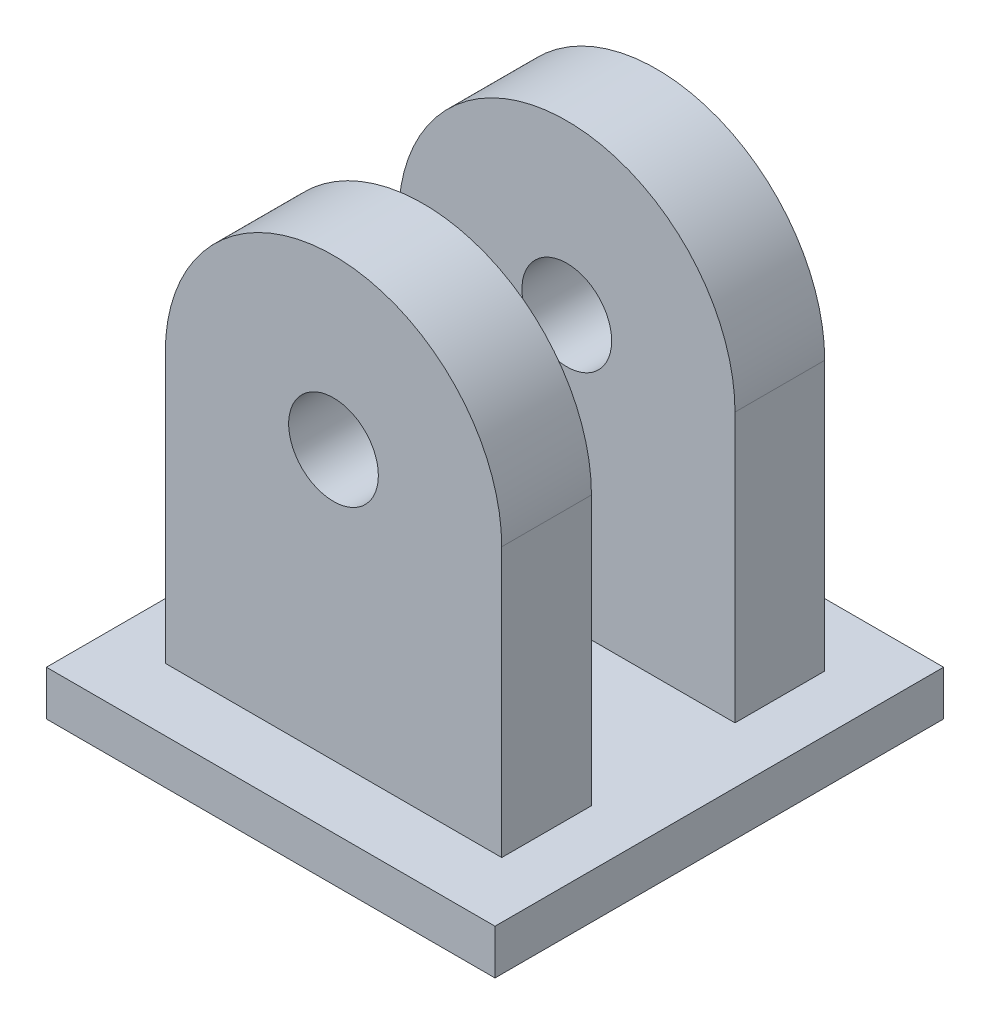
ISO-10303-21;
HEADER;
FILE_DESCRIPTION(('STEP AP214'),'2;1');
FILE_NAME('part.step','',(''),(''),'','','');
FILE_SCHEMA(('AUTOMOTIVE_DESIGN { 1 0 10303 214 1 1 1 1 }'));
ENDSEC;
DATA;
#1=APPLICATION_CONTEXT('core data for automotive mechanical design processes');
#2=APPLICATION_PROTOCOL_DEFINITION('international standard','automotive_design',2000,#1);
#3=PRODUCT_CONTEXT('',#1,'mechanical');
#4=PRODUCT('Part','Part','',(#3));
#5=PRODUCT_RELATED_PRODUCT_CATEGORY('part','',(#4));
#6=PRODUCT_DEFINITION_FORMATION('','',#4);
#7=PRODUCT_DEFINITION_CONTEXT('part definition',#1,'design');
#8=PRODUCT_DEFINITION('design','',#6,#7);
#9=PRODUCT_DEFINITION_SHAPE('','',#8);
#10=(LENGTH_UNIT() NAMED_UNIT(*) SI_UNIT(.MILLI.,.METRE.));
#11=(NAMED_UNIT(*) PLANE_ANGLE_UNIT() SI_UNIT($,.RADIAN.));
#12=(NAMED_UNIT(*) SI_UNIT($,.STERADIAN.) SOLID_ANGLE_UNIT());
#13=UNCERTAINTY_MEASURE_WITH_UNIT(LENGTH_MEASURE(1.E-05),#10,'distance_accuracy_value','');
#14=(GEOMETRIC_REPRESENTATION_CONTEXT(3) GLOBAL_UNCERTAINTY_ASSIGNED_CONTEXT((#13)) GLOBAL_UNIT_ASSIGNED_CONTEXT((#10,
#11,#12)) REPRESENTATION_CONTEXT('',''));
#15=CARTESIAN_POINT('',(0.,0.,0.));
#16=DIRECTION('',(0.,0.,1.));
#17=DIRECTION('',(1.,0.,0.));
#18=AXIS2_PLACEMENT_3D('',#15,#16,#17);
#19=CARTESIAN_POINT('',(0.,-6.,0.));
#20=DIRECTION('',(0.,1.,0.));
#21=DIRECTION('',(0.,0.,1.));
#22=AXIS2_PLACEMENT_3D('',#19,#20,#21);
#23=PLANE('',#22);
#24=DIRECTION('',(0.,0.,-1.));
#25=VECTOR('',#24,1.);
#26=CARTESIAN_POINT('',(-3.75,-6.,2.));
#27=LINE('',#26,#25);
#28=CARTESIAN_POINT('',(-3.75,-6.,2.));
#29=VERTEX_POINT('',#28);
#30=CARTESIAN_POINT('',(-3.75,-6.,0.));
#31=VERTEX_POINT('',#30);
#32=EDGE_CURVE('E41',#29,#31,#27,.T.);
#33=ORIENTED_EDGE('',*,*,#32,.T.);
#34=DIRECTION('',(1.,0.,0.));
#35=VECTOR('',#34,1.);
#36=CARTESIAN_POINT('',(3.75,-6.,0.));
#37=LINE('',#36,#35);
#38=CARTESIAN_POINT('',(3.75,-6.,0.));
#39=VERTEX_POINT('',#38);
#40=EDGE_CURVE('E207',#31,#39,#37,.T.);
#41=ORIENTED_EDGE('',*,*,#40,.T.);
#42=DIRECTION('',(0.,0.,-1.));
#43=VECTOR('',#42,1.);
#44=CARTESIAN_POINT('',(3.75,-6.,2.));
#45=LINE('',#44,#43);
#46=CARTESIAN_POINT('',(3.75,-6.,2.));
#47=VERTEX_POINT('',#46);
#48=EDGE_CURVE('E212',#47,#39,#45,.T.);
#49=ORIENTED_EDGE('',*,*,#48,.F.);
#50=DIRECTION('',(1.,0.,0.));
#51=VECTOR('',#50,1.);
#52=CARTESIAN_POINT('',(3.75,-6.,2.));
#53=LINE('',#52,#51);
#54=EDGE_CURVE('E198',#29,#47,#53,.T.);
#55=ORIENTED_EDGE('',*,*,#54,.F.);
#56=EDGE_LOOP('',(#33,#41,#49,#55));
#57=FACE_BOUND('',#56,.T.);
#58=DIRECTION('',(0.,0.,-1.));
#59=VECTOR('',#58,1.);
#60=CARTESIAN_POINT('',(-5.,-6.,8.6));
#61=LINE('',#60,#59);
#62=CARTESIAN_POINT('',(-5.,-6.,8.6));
#63=VERTEX_POINT('',#62);
#64=CARTESIAN_POINT('',(-5.,-6.,-1.4));
#65=VERTEX_POINT('',#64);
#66=EDGE_CURVE('E153',#63,#65,#61,.T.);
#67=ORIENTED_EDGE('',*,*,#66,.F.);
#68=DIRECTION('',(-1.,0.,0.));
#69=VECTOR('',#68,1.);
#70=CARTESIAN_POINT('',(5.,-6.,8.6));
#71=LINE('',#70,#69);
#72=CARTESIAN_POINT('',(5.,-6.,8.6));
#73=VERTEX_POINT('',#72);
#74=EDGE_CURVE('E166',#73,#63,#71,.T.);
#75=ORIENTED_EDGE('',*,*,#74,.F.);
#76=DIRECTION('',(0.,0.,1.));
#77=VECTOR('',#76,1.);
#78=CARTESIAN_POINT('',(5.,-6.,8.6));
#79=LINE('',#78,#77);
#80=CARTESIAN_POINT('',(5.,-6.,-1.4));
#81=VERTEX_POINT('',#80);
#82=EDGE_CURVE('E174',#81,#73,#79,.T.);
#83=ORIENTED_EDGE('',*,*,#82,.F.);
#84=DIRECTION('',(1.,0.,0.));
#85=VECTOR('',#84,1.);
#86=CARTESIAN_POINT('',(5.,-6.,-1.4));
#87=LINE('',#86,#85);
#88=EDGE_CURVE('E156',#65,#81,#87,.T.);
#89=ORIENTED_EDGE('',*,*,#88,.F.);
#90=EDGE_LOOP('',(#67,#75,#83,#89));
#91=FACE_BOUND('',#90,.T.);
#92=DIRECTION('',(1.,0.,0.));
#93=VECTOR('',#92,1.);
#94=CARTESIAN_POINT('',(3.75,-6.,7.2));
#95=LINE('',#94,#93);
#96=CARTESIAN_POINT('',(-3.75,-6.,7.2));
#97=VERTEX_POINT('',#96);
#98=CARTESIAN_POINT('',(3.75,-6.,7.2));
#99=VERTEX_POINT('',#98);
#100=EDGE_CURVE('E140',#97,#99,#95,.T.);
#101=ORIENTED_EDGE('',*,*,#100,.F.);
#102=DIRECTION('',(0.,0.,-1.));
#103=VECTOR('',#102,1.);
#104=CARTESIAN_POINT('',(-3.75,-6.,7.2));
#105=LINE('',#104,#103);
#106=CARTESIAN_POINT('',(-3.75,-6.,5.2));
#107=VERTEX_POINT('',#106);
#108=EDGE_CURVE('E137',#97,#107,#105,.T.);
#109=ORIENTED_EDGE('',*,*,#108,.T.);
#110=DIRECTION('',(1.,0.,0.));
#111=VECTOR('',#110,1.);
#112=CARTESIAN_POINT('',(3.75,-6.,5.2));
#113=LINE('',#112,#111);
#114=CARTESIAN_POINT('',(3.75,-6.,5.2));
#115=VERTEX_POINT('',#114);
#116=EDGE_CURVE('E404',#107,#115,#113,.T.);
#117=ORIENTED_EDGE('',*,*,#116,.T.);
#118=DIRECTION('',(0.,0.,-1.));
#119=VECTOR('',#118,1.);
#120=CARTESIAN_POINT('',(3.75,-6.,7.2));
#121=LINE('',#120,#119);
#122=EDGE_CURVE('E158',#99,#115,#121,.T.);
#123=ORIENTED_EDGE('',*,*,#122,.F.);
#124=EDGE_LOOP('',(#101,#109,#117,#123));
#125=FACE_BOUND('',#124,.T.);
#126=ADVANCED_FACE('F33',(#57,#91,#125),#23,.T.);
#127=CARTESIAN_POINT('',(0.,0.,2.));
#128=DIRECTION('',(0.,0.,1.));
#129=DIRECTION('',(1.,0.,0.));
#130=AXIS2_PLACEMENT_3D('',#127,#128,#129);
#131=PLANE('',#130);
#132=CARTESIAN_POINT('',(0.,0.,2.));
#133=DIRECTION('',(0.,0.,1.));
#134=DIRECTION('',(1.,0.,0.));
#135=AXIS2_PLACEMENT_3D('',#132,#133,#134);
#136=CIRCLE('',#135,3.75);
#137=CARTESIAN_POINT('',(3.75,0.,2.));
#138=VERTEX_POINT('',#137);
#139=CARTESIAN_POINT('',(-3.75,0.,2.));
#140=VERTEX_POINT('',#139);
#141=EDGE_CURVE('E195',#138,#140,#136,.T.);
#142=ORIENTED_EDGE('',*,*,#141,.T.);
#143=DIRECTION('',(0.,-1.,0.));
#144=VECTOR('',#143,1.);
#145=CARTESIAN_POINT('',(-3.75,0.,2.));
#146=LINE('',#145,#144);
#147=EDGE_CURVE('E81',#140,#29,#146,.T.);
#148=ORIENTED_EDGE('',*,*,#147,.T.);
#149=ORIENTED_EDGE('',*,*,#54,.T.);
#150=DIRECTION('',(0.,1.,0.));
#151=VECTOR('',#150,1.);
#152=CARTESIAN_POINT('',(3.75,0.,2.));
#153=LINE('',#152,#151);
#154=EDGE_CURVE('E57',#47,#138,#153,.T.);
#155=ORIENTED_EDGE('',*,*,#154,.T.);
#156=EDGE_LOOP('',(#142,#148,#149,#155));
#157=FACE_BOUND('',#156,.T.);
#158=CARTESIAN_POINT('',(0.,0.,2.));
#159=DIRECTION('',(0.,0.,1.));
#160=DIRECTION('',(1.,0.,0.));
#161=AXIS2_PLACEMENT_3D('',#158,#159,#160);
#162=CIRCLE('',#161,1.);
#163=CARTESIAN_POINT('',(1.,0.,2.));
#164=VERTEX_POINT('',#163);
#165=EDGE_CURVE('E189',#164,#164,#162,.T.);
#166=ORIENTED_EDGE('',*,*,#165,.F.);
#167=EDGE_LOOP('',(#166));
#168=FACE_BOUND('',#167,.T.);
#169=ADVANCED_FACE('F239',(#157,#168),#131,.T.);
#170=CARTESIAN_POINT('',(0.,0.,0.));
#171=DIRECTION('',(0.,0.,1.));
#172=DIRECTION('',(1.,0.,0.));
#173=AXIS2_PLACEMENT_3D('',#170,#171,#172);
#174=PLANE('',#173);
#175=CARTESIAN_POINT('',(0.,0.,0.));
#176=DIRECTION('',(0.,0.,1.));
#177=DIRECTION('',(1.,0.,0.));
#178=AXIS2_PLACEMENT_3D('',#175,#176,#177);
#179=CIRCLE('',#178,3.75);
#180=CARTESIAN_POINT('',(3.75,0.,0.));
#181=VERTEX_POINT('',#180);
#182=CARTESIAN_POINT('',(-3.75,0.,0.));
#183=VERTEX_POINT('',#182);
#184=EDGE_CURVE('E192',#181,#183,#179,.T.);
#185=ORIENTED_EDGE('',*,*,#184,.F.);
#186=DIRECTION('',(0.,1.,0.));
#187=VECTOR('',#186,1.);
#188=CARTESIAN_POINT('',(3.75,0.,0.));
#189=LINE('',#188,#187);
#190=EDGE_CURVE('E74',#39,#181,#189,.T.);
#191=ORIENTED_EDGE('',*,*,#190,.F.);
#192=ORIENTED_EDGE('',*,*,#40,.F.);
#193=DIRECTION('',(0.,-1.,0.));
#194=VECTOR('',#193,1.);
#195=CARTESIAN_POINT('',(-3.75,0.,0.));
#196=LINE('',#195,#194);
#197=EDGE_CURVE('E204',#183,#31,#196,.T.);
#198=ORIENTED_EDGE('',*,*,#197,.F.);
#199=EDGE_LOOP('',(#185,#191,#192,#198));
#200=FACE_BOUND('',#199,.T.);
#201=CARTESIAN_POINT('',(0.,0.,0.));
#202=DIRECTION('',(0.,0.,1.));
#203=DIRECTION('',(1.,0.,0.));
#204=AXIS2_PLACEMENT_3D('',#201,#202,#203);
#205=CIRCLE('',#204,1.);
#206=CARTESIAN_POINT('',(1.,0.,0.));
#207=VERTEX_POINT('',#206);
#208=EDGE_CURVE('E188',#207,#207,#205,.T.);
#209=ORIENTED_EDGE('',*,*,#208,.T.);
#210=EDGE_LOOP('',(#209));
#211=FACE_BOUND('',#210,.T.);
#212=ADVANCED_FACE('F222',(#200,#211),#174,.F.);
#213=CARTESIAN_POINT('',(0.,0.,2.));
#214=DIRECTION('',(0.,0.,-1.));
#215=DIRECTION('',(-1.,0.,0.));
#216=AXIS2_PLACEMENT_3D('',#213,#214,#215);
#217=CYLINDRICAL_SURFACE('',#216,3.75);
#218=ORIENTED_EDGE('',*,*,#184,.T.);
#219=DIRECTION('',(0.,0.,-1.));
#220=VECTOR('',#219,1.);
#221=CARTESIAN_POINT('',(-3.75,0.,2.));
#222=LINE('',#221,#220);
#223=EDGE_CURVE('E11',#140,#183,#222,.T.);
#224=ORIENTED_EDGE('',*,*,#223,.F.);
#225=ORIENTED_EDGE('',*,*,#141,.F.);
#226=DIRECTION('',(0.,0.,-1.));
#227=VECTOR('',#226,1.);
#228=CARTESIAN_POINT('',(3.75,0.,2.));
#229=LINE('',#228,#227);
#230=EDGE_CURVE('E201',#138,#181,#229,.T.);
#231=ORIENTED_EDGE('',*,*,#230,.T.);
#232=EDGE_LOOP('',(#218,#224,#225,#231));
#233=FACE_BOUND('',#232,.T.);
#234=ADVANCED_FACE('F35',(#233),#217,.T.);
#235=CARTESIAN_POINT('',(-3.75,0.,2.));
#236=DIRECTION('',(1.,0.,0.));
#237=DIRECTION('',(0.,1.,0.));
#238=AXIS2_PLACEMENT_3D('',#235,#236,#237);
#239=PLANE('',#238);
#240=ORIENTED_EDGE('',*,*,#197,.T.);
#241=ORIENTED_EDGE('',*,*,#32,.F.);
#242=ORIENTED_EDGE('',*,*,#147,.F.);
#243=ORIENTED_EDGE('',*,*,#223,.T.);
#244=EDGE_LOOP('',(#240,#241,#242,#243));
#245=FACE_BOUND('',#244,.T.);
#246=ADVANCED_FACE('F218',(#245),#239,.F.);
#247=CARTESIAN_POINT('',(3.75,0.,2.));
#248=DIRECTION('',(-1.,0.,0.));
#249=DIRECTION('',(0.,-1.,0.));
#250=AXIS2_PLACEMENT_3D('',#247,#248,#249);
#251=PLANE('',#250);
#252=ORIENTED_EDGE('',*,*,#190,.T.);
#253=ORIENTED_EDGE('',*,*,#230,.F.);
#254=ORIENTED_EDGE('',*,*,#154,.F.);
#255=ORIENTED_EDGE('',*,*,#48,.T.);
#256=EDGE_LOOP('',(#252,#253,#254,#255));
#257=FACE_BOUND('',#256,.T.);
#258=ADVANCED_FACE('F226',(#257),#251,.F.);
#259=CARTESIAN_POINT('',(0.,0.,2.));
#260=DIRECTION('',(0.,0.,-1.));
#261=DIRECTION('',(-1.,0.,0.));
#262=AXIS2_PLACEMENT_3D('',#259,#260,#261);
#263=CYLINDRICAL_SURFACE('',#262,1.);
#264=ORIENTED_EDGE('',*,*,#165,.T.);
#265=EDGE_LOOP('',(#264));
#266=FACE_BOUND('',#265,.T.);
#267=ORIENTED_EDGE('',*,*,#208,.F.);
#268=EDGE_LOOP('',(#267));
#269=FACE_BOUND('',#268,.T.);
#270=ADVANCED_FACE('F228',(#266,#269),#263,.F.);
#271=CARTESIAN_POINT('',(-5.,-7.,8.6));
#272=DIRECTION('',(1.,0.,0.));
#273=DIRECTION('',(0.,0.,-1.));
#274=AXIS2_PLACEMENT_3D('',#271,#272,#273);
#275=PLANE('',#274);
#276=ORIENTED_EDGE('',*,*,#66,.T.);
#277=DIRECTION('',(0.,1.,0.));
#278=VECTOR('',#277,1.);
#279=CARTESIAN_POINT('',(-5.,-7.,-1.4));
#280=LINE('',#279,#278);
#281=CARTESIAN_POINT('',(-5.,-7.,-1.4));
#282=VERTEX_POINT('',#281);
#283=EDGE_CURVE('E185',#282,#65,#280,.T.);
#284=ORIENTED_EDGE('',*,*,#283,.F.);
#285=DIRECTION('',(0.,0.,-1.));
#286=VECTOR('',#285,1.);
#287=CARTESIAN_POINT('',(-5.,-7.,8.6));
#288=LINE('',#287,#286);
#289=CARTESIAN_POINT('',(-5.,-7.,8.6));
#290=VERTEX_POINT('',#289);
#291=EDGE_CURVE('E162',#290,#282,#288,.T.);
#292=ORIENTED_EDGE('',*,*,#291,.F.);
#293=DIRECTION('',(0.,1.,0.));
#294=VECTOR('',#293,1.);
#295=CARTESIAN_POINT('',(-5.,-7.,8.6));
#296=LINE('',#295,#294);
#297=EDGE_CURVE('E171',#290,#63,#296,.T.);
#298=ORIENTED_EDGE('',*,*,#297,.T.);
#299=EDGE_LOOP('',(#276,#284,#292,#298));
#300=FACE_BOUND('',#299,.T.);
#301=ADVANCED_FACE('F234',(#300),#275,.F.);
#302=CARTESIAN_POINT('',(5.,-7.,-1.4));
#303=DIRECTION('',(0.,0.,1.));
#304=DIRECTION('',(1.,0.,0.));
#305=AXIS2_PLACEMENT_3D('',#302,#303,#304);
#306=PLANE('',#305);
#307=ORIENTED_EDGE('',*,*,#88,.T.);
#308=DIRECTION('',(0.,1.,0.));
#309=VECTOR('',#308,1.);
#310=CARTESIAN_POINT('',(5.,-7.,-1.4));
#311=LINE('',#310,#309);
#312=CARTESIAN_POINT('',(5.,-7.,-1.4));
#313=VERTEX_POINT('',#312);
#314=EDGE_CURVE('E182',#313,#81,#311,.T.);
#315=ORIENTED_EDGE('',*,*,#314,.F.);
#316=DIRECTION('',(1.,0.,0.));
#317=VECTOR('',#316,1.);
#318=CARTESIAN_POINT('',(5.,-7.,-1.4));
#319=LINE('',#318,#317);
#320=EDGE_CURVE('E165',#282,#313,#319,.T.);
#321=ORIENTED_EDGE('',*,*,#320,.F.);
#322=ORIENTED_EDGE('',*,*,#283,.T.);
#323=EDGE_LOOP('',(#307,#315,#321,#322));
#324=FACE_BOUND('',#323,.T.);
#325=ADVANCED_FACE('F256',(#324),#306,.F.);
#326=CARTESIAN_POINT('',(5.,-7.,8.6));
#327=DIRECTION('',(-1.,0.,0.));
#328=DIRECTION('',(0.,0.,1.));
#329=AXIS2_PLACEMENT_3D('',#326,#327,#328);
#330=PLANE('',#329);
#331=ORIENTED_EDGE('',*,*,#82,.T.);
#332=DIRECTION('',(0.,1.,0.));
#333=VECTOR('',#332,1.);
#334=CARTESIAN_POINT('',(5.,-7.,8.6));
#335=LINE('',#334,#333);
#336=CARTESIAN_POINT('',(5.,-7.,8.6));
#337=VERTEX_POINT('',#336);
#338=EDGE_CURVE('E179',#337,#73,#335,.T.);
#339=ORIENTED_EDGE('',*,*,#338,.F.);
#340=DIRECTION('',(0.,0.,1.));
#341=VECTOR('',#340,1.);
#342=CARTESIAN_POINT('',(5.,-7.,8.6));
#343=LINE('',#342,#341);
#344=EDGE_CURVE('E168',#313,#337,#343,.T.);
#345=ORIENTED_EDGE('',*,*,#344,.F.);
#346=ORIENTED_EDGE('',*,*,#314,.T.);
#347=EDGE_LOOP('',(#331,#339,#345,#346));
#348=FACE_BOUND('',#347,.T.);
#349=ADVANCED_FACE('F252',(#348),#330,.F.);
#350=CARTESIAN_POINT('',(5.,-7.,8.6));
#351=DIRECTION('',(0.,0.,-1.));
#352=DIRECTION('',(-1.,0.,0.));
#353=AXIS2_PLACEMENT_3D('',#350,#351,#352);
#354=PLANE('',#353);
#355=ORIENTED_EDGE('',*,*,#74,.T.);
#356=ORIENTED_EDGE('',*,*,#297,.F.);
#357=DIRECTION('',(-1.,0.,0.));
#358=VECTOR('',#357,1.);
#359=CARTESIAN_POINT('',(5.,-7.,8.6));
#360=LINE('',#359,#358);
#361=EDGE_CURVE('E170',#337,#290,#360,.T.);
#362=ORIENTED_EDGE('',*,*,#361,.F.);
#363=ORIENTED_EDGE('',*,*,#338,.T.);
#364=EDGE_LOOP('',(#355,#356,#362,#363));
#365=FACE_BOUND('',#364,.T.);
#366=ADVANCED_FACE('F249',(#365),#354,.F.);
#367=CARTESIAN_POINT('',(0.,-7.,0.));
#368=DIRECTION('',(0.,1.,0.));
#369=DIRECTION('',(0.,0.,1.));
#370=AXIS2_PLACEMENT_3D('',#367,#368,#369);
#371=PLANE('',#370);
#372=ORIENTED_EDGE('',*,*,#291,.T.);
#373=ORIENTED_EDGE('',*,*,#320,.T.);
#374=ORIENTED_EDGE('',*,*,#344,.T.);
#375=ORIENTED_EDGE('',*,*,#361,.T.);
#376=EDGE_LOOP('',(#372,#373,#374,#375));
#377=FACE_BOUND('',#376,.T.);
#378=ADVANCED_FACE('F247',(#377),#371,.F.);
#379=CARTESIAN_POINT('',(0.,0.,7.2));
#380=DIRECTION('',(0.,0.,1.));
#381=DIRECTION('',(1.,0.,0.));
#382=AXIS2_PLACEMENT_3D('',#379,#380,#381);
#383=PLANE('',#382);
#384=CARTESIAN_POINT('',(0.,0.,7.2));
#385=DIRECTION('',(0.,0.,1.));
#386=DIRECTION('',(1.,0.,0.));
#387=AXIS2_PLACEMENT_3D('',#384,#385,#386);
#388=CIRCLE('',#387,3.75);
#389=CARTESIAN_POINT('',(3.75,0.,7.2));
#390=VERTEX_POINT('',#389);
#391=CARTESIAN_POINT('',(-3.75,0.,7.2));
#392=VERTEX_POINT('',#391);
#393=EDGE_CURVE('E141',#390,#392,#388,.T.);
#394=ORIENTED_EDGE('',*,*,#393,.T.);
#395=DIRECTION('',(0.,-1.,0.));
#396=VECTOR('',#395,1.);
#397=CARTESIAN_POINT('',(-3.75,0.,7.2));
#398=LINE('',#397,#396);
#399=EDGE_CURVE('E130',#392,#97,#398,.T.);
#400=ORIENTED_EDGE('',*,*,#399,.T.);
#401=ORIENTED_EDGE('',*,*,#100,.T.);
#402=DIRECTION('',(0.,1.,0.));
#403=VECTOR('',#402,1.);
#404=CARTESIAN_POINT('',(3.75,0.,7.2));
#405=LINE('',#404,#403);
#406=EDGE_CURVE('E48',#99,#390,#405,.T.);
#407=ORIENTED_EDGE('',*,*,#406,.T.);
#408=EDGE_LOOP('',(#394,#400,#401,#407));
#409=FACE_BOUND('',#408,.T.);
#410=CARTESIAN_POINT('',(0.,0.,7.2));
#411=DIRECTION('',(0.,0.,1.));
#412=DIRECTION('',(1.,0.,0.));
#413=AXIS2_PLACEMENT_3D('',#410,#411,#412);
#414=CIRCLE('',#413,1.);
#415=CARTESIAN_POINT('',(1.,0.,7.2));
#416=VERTEX_POINT('',#415);
#417=EDGE_CURVE('E390',#416,#416,#414,.T.);
#418=ORIENTED_EDGE('',*,*,#417,.F.);
#419=EDGE_LOOP('',(#418));
#420=FACE_BOUND('',#419,.T.);
#421=ADVANCED_FACE('F144',(#409,#420),#383,.T.);
#422=CARTESIAN_POINT('',(0.,0.,5.2));
#423=DIRECTION('',(0.,0.,1.));
#424=DIRECTION('',(1.,0.,0.));
#425=AXIS2_PLACEMENT_3D('',#422,#423,#424);
#426=PLANE('',#425);
#427=CARTESIAN_POINT('',(0.,0.,5.2));
#428=DIRECTION('',(0.,0.,1.));
#429=DIRECTION('',(1.,0.,0.));
#430=AXIS2_PLACEMENT_3D('',#427,#428,#429);
#431=CIRCLE('',#430,3.75);
#432=CARTESIAN_POINT('',(3.75,0.,5.2));
#433=VERTEX_POINT('',#432);
#434=CARTESIAN_POINT('',(-3.75,0.,5.2));
#435=VERTEX_POINT('',#434);
#436=EDGE_CURVE('E152',#433,#435,#431,.T.);
#437=ORIENTED_EDGE('',*,*,#436,.F.);
#438=DIRECTION('',(0.,1.,0.));
#439=VECTOR('',#438,1.);
#440=CARTESIAN_POINT('',(3.75,0.,5.2));
#441=LINE('',#440,#439);
#442=EDGE_CURVE('E148',#115,#433,#441,.T.);
#443=ORIENTED_EDGE('',*,*,#442,.F.);
#444=ORIENTED_EDGE('',*,*,#116,.F.);
#445=DIRECTION('',(0.,-1.,0.));
#446=VECTOR('',#445,1.);
#447=CARTESIAN_POINT('',(-3.75,0.,5.2));
#448=LINE('',#447,#446);
#449=EDGE_CURVE('E402',#435,#107,#448,.T.);
#450=ORIENTED_EDGE('',*,*,#449,.F.);
#451=EDGE_LOOP('',(#437,#443,#444,#450));
#452=FACE_BOUND('',#451,.T.);
#453=CARTESIAN_POINT('',(0.,0.,5.2));
#454=DIRECTION('',(0.,0.,1.));
#455=DIRECTION('',(1.,0.,0.));
#456=AXIS2_PLACEMENT_3D('',#453,#454,#455);
#457=CIRCLE('',#456,1.);
#458=CARTESIAN_POINT('',(1.,0.,5.2));
#459=VERTEX_POINT('',#458);
#460=EDGE_CURVE('E393',#459,#459,#457,.T.);
#461=ORIENTED_EDGE('',*,*,#460,.T.);
#462=EDGE_LOOP('',(#461));
#463=FACE_BOUND('',#462,.T.);
#464=ADVANCED_FACE('F324',(#452,#463),#426,.F.);
#465=CARTESIAN_POINT('',(0.,0.,7.2));
#466=DIRECTION('',(0.,0.,-1.));
#467=DIRECTION('',(-1.,0.,0.));
#468=AXIS2_PLACEMENT_3D('',#465,#466,#467);
#469=CYLINDRICAL_SURFACE('',#468,3.75);
#470=ORIENTED_EDGE('',*,*,#436,.T.);
#471=DIRECTION('',(0.,0.,-1.));
#472=VECTOR('',#471,1.);
#473=CARTESIAN_POINT('',(-3.75,0.,7.2));
#474=LINE('',#473,#472);
#475=EDGE_CURVE('E134',#392,#435,#474,.T.);
#476=ORIENTED_EDGE('',*,*,#475,.F.);
#477=ORIENTED_EDGE('',*,*,#393,.F.);
#478=DIRECTION('',(0.,0.,-1.));
#479=VECTOR('',#478,1.);
#480=CARTESIAN_POINT('',(3.75,0.,7.2));
#481=LINE('',#480,#479);
#482=EDGE_CURVE('E400',#390,#433,#481,.T.);
#483=ORIENTED_EDGE('',*,*,#482,.T.);
#484=EDGE_LOOP('',(#470,#476,#477,#483));
#485=FACE_BOUND('',#484,.T.);
#486=ADVANCED_FACE('F150',(#485),#469,.T.);
#487=CARTESIAN_POINT('',(-3.75,0.,7.2));
#488=DIRECTION('',(1.,0.,0.));
#489=DIRECTION('',(0.,1.,0.));
#490=AXIS2_PLACEMENT_3D('',#487,#488,#489);
#491=PLANE('',#490);
#492=ORIENTED_EDGE('',*,*,#449,.T.);
#493=ORIENTED_EDGE('',*,*,#108,.F.);
#494=ORIENTED_EDGE('',*,*,#399,.F.);
#495=ORIENTED_EDGE('',*,*,#475,.T.);
#496=EDGE_LOOP('',(#492,#493,#494,#495));
#497=FACE_BOUND('',#496,.T.);
#498=ADVANCED_FACE('F132',(#497),#491,.F.);
#499=CARTESIAN_POINT('',(3.75,0.,7.2));
#500=DIRECTION('',(-1.,0.,0.));
#501=DIRECTION('',(0.,-1.,0.));
#502=AXIS2_PLACEMENT_3D('',#499,#500,#501);
#503=PLANE('',#502);
#504=ORIENTED_EDGE('',*,*,#442,.T.);
#505=ORIENTED_EDGE('',*,*,#482,.F.);
#506=ORIENTED_EDGE('',*,*,#406,.F.);
#507=ORIENTED_EDGE('',*,*,#122,.T.);
#508=EDGE_LOOP('',(#504,#505,#506,#507));
#509=FACE_BOUND('',#508,.T.);
#510=ADVANCED_FACE('F349',(#509),#503,.F.);
#511=CARTESIAN_POINT('',(0.,0.,7.2));
#512=DIRECTION('',(0.,0.,-1.));
#513=DIRECTION('',(-1.,0.,0.));
#514=AXIS2_PLACEMENT_3D('',#511,#512,#513);
#515=CYLINDRICAL_SURFACE('',#514,1.);
#516=ORIENTED_EDGE('',*,*,#417,.T.);
#517=EDGE_LOOP('',(#516));
#518=FACE_BOUND('',#517,.T.);
#519=ORIENTED_EDGE('',*,*,#460,.F.);
#520=EDGE_LOOP('',(#519));
#521=FACE_BOUND('',#520,.T.);
#522=ADVANCED_FACE('F358',(#518,#521),#515,.F.);
#523=CLOSED_SHELL('',(#126,#169,#212,#234,#246,#258,#270,#301,#325,#349,#366,#378,#421,#464,
#486,#498,#510,#522));
#524=MANIFOLD_SOLID_BREP('B2',#523);
#525=ADVANCED_BREP_SHAPE_REPRESENTATION('',(#18,#524),#14);
#526=SHAPE_DEFINITION_REPRESENTATION(#9,#525);
ENDSEC;
END-ISO-10303-21;
